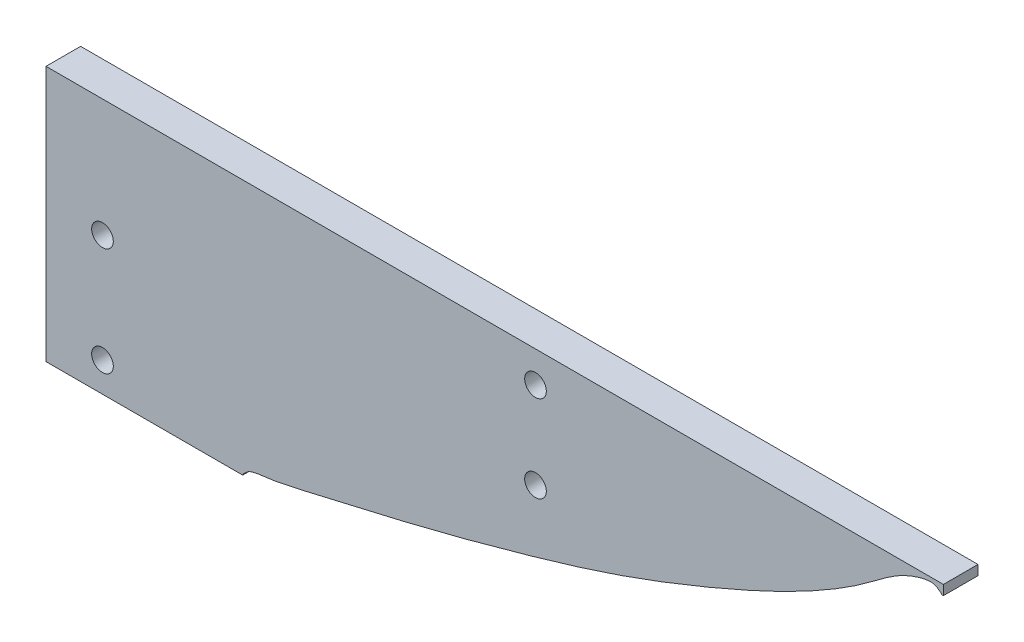
ISO-10303-21;
HEADER;
FILE_DESCRIPTION(('STEP AP214'),'2;1');
FILE_NAME('part.step','',(''),(''),'','','');
FILE_SCHEMA(('AUTOMOTIVE_DESIGN { 1 0 10303 214 1 1 1 1 }'));
ENDSEC;
DATA;
#1=APPLICATION_CONTEXT('core data for automotive mechanical design processes');
#2=APPLICATION_PROTOCOL_DEFINITION('international standard','automotive_design',2000,#1);
#3=PRODUCT_CONTEXT('',#1,'mechanical');
#4=PRODUCT('Part','Part','',(#3));
#5=PRODUCT_RELATED_PRODUCT_CATEGORY('part','',(#4));
#6=PRODUCT_DEFINITION_FORMATION('','',#4);
#7=PRODUCT_DEFINITION_CONTEXT('part definition',#1,'design');
#8=PRODUCT_DEFINITION('design','',#6,#7);
#9=PRODUCT_DEFINITION_SHAPE('','',#8);
#10=(LENGTH_UNIT() NAMED_UNIT(*) SI_UNIT(.MILLI.,.METRE.));
#11=(NAMED_UNIT(*) PLANE_ANGLE_UNIT() SI_UNIT($,.RADIAN.));
#12=(NAMED_UNIT(*) SI_UNIT($,.STERADIAN.) SOLID_ANGLE_UNIT());
#13=UNCERTAINTY_MEASURE_WITH_UNIT(LENGTH_MEASURE(1.E-05),#10,'distance_accuracy_value','');
#14=(GEOMETRIC_REPRESENTATION_CONTEXT(3) GLOBAL_UNCERTAINTY_ASSIGNED_CONTEXT((#13)) GLOBAL_UNIT_ASSIGNED_CONTEXT((#10,
#11,#12)) REPRESENTATION_CONTEXT('',''));
#15=CARTESIAN_POINT('',(0.,0.,0.));
#16=DIRECTION('',(0.,0.,1.));
#17=DIRECTION('',(1.,0.,0.));
#18=AXIS2_PLACEMENT_3D('',#15,#16,#17);
#19=CARTESIAN_POINT('',(16.0234158138627,-34.5026741062025,244.));
#20=DIRECTION('',(0.,0.,-1.));
#21=DIRECTION('',(-1.,0.,0.));
#22=AXIS2_PLACEMENT_3D('',#19,#20,#21);
#23=PLANE('',#22);
#24=CARTESIAN_POINT('',(-100.,-50.,244.));
#25=DIRECTION('',(0.,0.,-1.));
#26=DIRECTION('',(-1.,0.,0.));
#27=AXIS2_PLACEMENT_3D('',#24,#25,#26);
#28=CIRCLE('',#27,2.5);
#29=CARTESIAN_POINT('',(-102.5,-50.,244.));
#30=VERTEX_POINT('',#29);
#31=EDGE_CURVE('E249',#30,#30,#28,.F.);
#32=ORIENTED_EDGE('',*,*,#31,.F.);
#33=EDGE_LOOP('',(#32));
#34=FACE_BOUND('',#33,.T.);
#35=CARTESIAN_POINT('',(0.0705666698621599,-4.96037406111782,244.));
#36=DIRECTION('',(0.,0.,-1.));
#37=DIRECTION('',(-1.,0.,0.));
#38=AXIS2_PLACEMENT_3D('',#35,#36,#37);
#39=CIRCLE('',#38,2.5);
#40=CARTESIAN_POINT('',(-2.42943333013784,-4.96037406111782,244.));
#41=VERTEX_POINT('',#40);
#42=EDGE_CURVE('E159',#41,#41,#39,.F.);
#43=ORIENTED_EDGE('',*,*,#42,.F.);
#44=EDGE_LOOP('',(#43));
#45=FACE_BOUND('',#44,.T.);
#46=DIRECTION('',(0.,1.,0.));
#47=VECTOR('',#46,1.);
#48=CARTESIAN_POINT('',(94.3374906603413,2.25600000000004,244.));
#49=LINE('',#48,#47);
#50=CARTESIAN_POINT('',(94.3374906603413,0.,244.));
#51=VERTEX_POINT('',#50);
#52=CARTESIAN_POINT('',(94.3374906603413,2.25600000000004,244.));
#53=VERTEX_POINT('',#52);
#54=EDGE_CURVE('E211',#51,#53,#49,.T.);
#55=ORIENTED_EDGE('',*,*,#54,.T.);
#56=DIRECTION('',(-1.,0.,0.));
#57=VECTOR('',#56,1.);
#58=CARTESIAN_POINT('',(94.3374906603413,2.25600000000004,244.));
#59=LINE('',#58,#57);
#60=CARTESIAN_POINT('',(-113.053115054968,2.25600000000002,244.));
#61=VERTEX_POINT('',#60);
#62=EDGE_CURVE('E87',#53,#61,#59,.T.);
#63=ORIENTED_EDGE('',*,*,#62,.T.);
#64=DIRECTION('',(0.,-1.,0.));
#65=VECTOR('',#64,1.);
#66=CARTESIAN_POINT('',(-113.053115054968,-56.8547276738667,244.));
#67=LINE('',#66,#65);
#68=CARTESIAN_POINT('',(-113.053115054968,-56.8547276738667,244.));
#69=VERTEX_POINT('',#68);
#70=EDGE_CURVE('E102',#61,#69,#67,.T.);
#71=ORIENTED_EDGE('',*,*,#70,.T.);
#72=CARTESIAN_POINT('',(-67.6058687206929,-56.8418835860353,244.));
#73=CARTESIAN_POINT('',(-82.7549499858999,-56.8485144926589,244.));
#74=CARTESIAN_POINT('',(-97.9040324773684,-56.8526768624681,244.));
#75=CARTESIAN_POINT('',(-113.053115054968,-56.8547276738667,244.));
#76=B_SPLINE_CURVE_WITH_KNOTS('',3,(#72,#73,#74,#75),.UNSPECIFIED.,.F.,.F.,(4,4),(0.,1.),.UNSPECIFIED.);
#77=CARTESIAN_POINT('',(-67.6058687206929,-56.8418835860353,244.));
#78=VERTEX_POINT('',#77);
#79=EDGE_CURVE('E94',#69,#78,#76,.F.);
#80=ORIENTED_EDGE('',*,*,#79,.T.);
#81=CARTESIAN_POINT('',(93.9707930966322,0.,244.));
#82=CARTESIAN_POINT('',(93.9275403182848,0.108219442954762,244.));
#83=CARTESIAN_POINT('',(93.8515123739752,0.197559643684799,244.));
#84=CARTESIAN_POINT('',(93.67922994041,0.351942409052488,244.));
#85=CARTESIAN_POINT('',(93.5863049471862,0.420181322273814,244.));
#86=CARTESIAN_POINT('',(93.3087181605546,0.62646610622649,244.));
#87=CARTESIAN_POINT('',(93.1280757033314,0.770408507314695,244.));
#88=CARTESIAN_POINT('',(92.8363623344284,0.957102782526559,244.));
#89=CARTESIAN_POINT('',(92.7372174680877,1.01507099163973,244.));
#90=CARTESIAN_POINT('',(92.5318138996805,1.11510463160574,244.));
#91=CARTESIAN_POINT('',(92.4251796757464,1.15633059396077,244.));
#92=CARTESIAN_POINT('',(92.2044880205878,1.22218814904138,244.));
#93=CARTESIAN_POINT('',(92.0903333875853,1.24685606961062,244.));
#94=CARTESIAN_POINT('',(91.8632049897598,1.28156541133741,244.));
#95=CARTESIAN_POINT('',(91.7492315764144,1.29196888619851,244.));
#96=CARTESIAN_POINT('',(91.4064338640623,1.30827396637541,244.));
#97=CARTESIAN_POINT('',(91.1759293714281,1.299779944813,244.));
#98=CARTESIAN_POINT('',(90.7175766833427,1.261729398113,244.));
#99=CARTESIAN_POINT('',(90.4907118184743,1.23319773255241,244.));
#100=CARTESIAN_POINT('',(89.8159360684446,1.12367164474916,244.));
#101=CARTESIAN_POINT('',(89.374032052032,1.01797284666055,244.));
#102=CARTESIAN_POINT('',(88.0596026898748,0.654474282836276,244.));
#103=CARTESIAN_POINT('',(87.1942939444121,0.346001243364463,244.));
#104=CARTESIAN_POINT('',(85.5207908631669,-0.358364862036478,244.));
#105=CARTESIAN_POINT('',(84.7112111539212,-0.756873368954198,244.));
#106=CARTESIAN_POINT('',(82.3614627180315,-2.0870706984647,244.));
#107=CARTESIAN_POINT('',(80.8966464527703,-3.14722848406273,244.));
#108=CARTESIAN_POINT('',(78.7184676222512,-4.76993608969079,244.));
#109=CARTESIAN_POINT('',(77.9950027799551,-5.31507038091878,244.));
#110=CARTESIAN_POINT('',(76.5372189539881,-6.38795546293028,244.));
#111=CARTESIAN_POINT('',(75.8041756196282,-6.91778466832084,244.));
#112=CARTESIAN_POINT('',(73.5820071703193,-8.4705713661439,244.));
#113=CARTESIAN_POINT('',(72.0687676522482,-9.45511390944258,244.));
#114=CARTESIAN_POINT('',(68.999021363187,-11.3552729972661,244.));
#115=CARTESIAN_POINT('',(67.4429916362822,-12.2716494869643,244.));
#116=CARTESIAN_POINT('',(64.2992114706245,-14.0538704450642,244.));
#117=CARTESIAN_POINT('',(62.7111094292256,-14.9191824328191,244.));
#118=CARTESIAN_POINT('',(59.5025622507668,-16.5981721855823,244.));
#119=CARTESIAN_POINT('',(57.8852599548048,-17.4109944878017,244.));
#120=CARTESIAN_POINT('',(54.6299645111503,-18.9942804538438,244.));
#121=CARTESIAN_POINT('',(52.9920024867879,-19.7649381513053,244.));
#122=CARTESIAN_POINT('',(49.7020068935009,-21.2769109339562,244.));
#123=CARTESIAN_POINT('',(48.0505965279488,-22.0177488041862,244.));
#124=CARTESIAN_POINT('',(43.0792383362596,-24.1998027856536,244.));
#125=CARTESIAN_POINT('',(39.7428210008403,-25.602112693722,244.));
#126=CARTESIAN_POINT('',(33.0338549618342,-28.3213787615113,244.));
#127=CARTESIAN_POINT('',(29.660726288783,-29.6383328992337,244.));
#128=CARTESIAN_POINT('',(22.8742607575603,-32.1610889929733,244.));
#129=CARTESIAN_POINT('',(19.4582616287561,-33.3629495630936,244.));
#130=CARTESIAN_POINT('',(12.5885699989693,-35.6423986493115,244.));
#131=CARTESIAN_POINT('',(9.13439519223916,-36.7214663933854,244.));
#132=CARTESIAN_POINT('',(2.20083527520231,-38.8004887891085,244.));
#133=CARTESIAN_POINT('',(-1.27752092467049,-39.8040045908362,244.));
#134=CARTESIAN_POINT('',(-8.24529714298655,-41.7673553220059,244.));
#135=CARTESIAN_POINT('',(-11.7355628978581,-42.7258900143628,244.));
#136=CARTESIAN_POINT('',(-18.7316863652625,-44.5863854823952,244.));
#137=CARTESIAN_POINT('',(-22.237775764295,-45.4876819452554,244.));
#138=CARTESIAN_POINT('',(-29.2636636323704,-47.2337799191878,244.));
#139=CARTESIAN_POINT('',(-32.7836131588108,-48.0789347968884,244.));
#140=CARTESIAN_POINT('',(-39.8300278640101,-49.7409646669693,244.));
#141=CARTESIAN_POINT('',(-43.3563547751734,-50.558718901895,244.));
#142=CARTESIAN_POINT('',(-48.6467948336615,-51.7811456585302,244.));
#143=CARTESIAN_POINT('',(-50.4106152657908,-52.1871708019159,244.));
#144=CARTESIAN_POINT('',(-53.0579396863378,-52.7891825790351,244.));
#145=CARTESIAN_POINT('',(-53.9406500835586,-52.9886663444595,244.));
#146=CARTESIAN_POINT('',(-55.7065733356938,-53.3854164049983,244.));
#147=CARTESIAN_POINT('',(-56.5893083246826,-53.585137271377,244.));
#148=CARTESIAN_POINT('',(-58.3580405043806,-53.9675043255969,244.));
#149=CARTESIAN_POINT('',(-59.244603599218,-54.1472728377844,244.));
#150=CARTESIAN_POINT('',(-60.5823987338824,-54.3756171020032,244.));
#151=CARTESIAN_POINT('',(-61.029600199552,-54.4451345744217,244.));
#152=CARTESIAN_POINT('',(-61.9267430162625,-54.5699338518092,244.));
#153=CARTESIAN_POINT('',(-62.3771743694561,-54.6226697445405,244.));
#154=CARTESIAN_POINT('',(-63.2789656383133,-54.7233169827186,244.));
#155=CARTESIAN_POINT('',(-63.7296802314879,-54.7745812408264,244.));
#156=CARTESIAN_POINT('',(-64.6233397254468,-54.9174788754777,244.));
#157=CARTESIAN_POINT('',(-65.0671747111058,-55.0044876234114,244.));
#158=CARTESIAN_POINT('',(-65.7167553540409,-55.2190250170581,244.));
#159=CARTESIAN_POINT('',(-65.9327296769614,-55.3064650102381,244.));
#160=CARTESIAN_POINT('',(-66.3446965323808,-55.5260279098127,244.));
#161=CARTESIAN_POINT('',(-66.5334026612515,-55.6577750476709,244.));
#162=CARTESIAN_POINT('',(-66.8877333850458,-55.9506142910006,244.));
#163=CARTESIAN_POINT('',(-67.0521612729492,-56.1132278433931,244.));
#164=CARTESIAN_POINT('',(-67.2957794548117,-56.3609923233848,244.));
#165=CARTESIAN_POINT('',(-67.3758082959976,-56.444932838751,244.));
#166=CARTESIAN_POINT('',(-67.5186403225355,-56.6274554545185,244.));
#167=CARTESIAN_POINT('',(-67.5797396857252,-56.729557594596,244.));
#168=CARTESIAN_POINT('',(-67.6058687206929,-56.8418835860353,244.));
#169=B_SPLINE_CURVE_WITH_KNOTS('',3,(#81,#82,#83,#84,#85,#86,#87,#88,#89,#90,#91,#92,#93,#94,
#95,#96,#97,#98,#99,#100,#101,#102,#103,#104,#105,#106,#107,#108,#109,#110,#111,#112,#113,#114,
#115,#116,#117,#118,#119,#120,#121,#122,#123,#124,#125,#126,#127,#128,#129,#130,#131,#132,#133,
#134,#135,#136,#137,#138,#139,#140,#141,#142,#143,#144,#145,#146,#147,#148,#149,#150,#151,#152,
#153,#154,#155,#156,#157,#158,#159,#160,#161,#162,#163,#164,#165,#166,#167,#168),.UNSPECIFIED.,
.F.,.F.,(4,2,2,2,2,2,2,2,2,2,2,2,2,2,2,2,2,2,2,2,2,2,2,2,2,2,2,2,2,2,2,2,2,2,2,2,2,2,2,2,2,2,2,
4),(0.,0.001953125,0.00390625,0.00781249999999978,0.00976562499999978,0.0117187499999998,
0.0136718749999998,0.0156249999999998,0.0195312499999998,0.0234374999999998,0.0312499999999998,
0.0468749999999998,0.0624999999999998,0.0937499999999996,0.109374999999999,0.124999999999999,
0.156249999999999,0.187499999999999,0.218749999999999,0.249999999999999,0.281249999999999,
0.312499999999999,0.374999999999999,0.4375,0.5,0.5625,0.625,0.6875,0.75,0.8125,0.875,0.90625,
0.921875,0.9375,0.953125,0.9609375,0.96875,0.9765625,0.984375,0.98828125,0.9921875,0.99609375,
0.998046875,1.),.UNSPECIFIED.);
#170=CARTESIAN_POINT('',(93.9707930966322,0.,244.));
#171=VERTEX_POINT('',#170);
#172=EDGE_CURVE('E99',#78,#171,#169,.F.);
#173=ORIENTED_EDGE('',*,*,#172,.T.);
#174=DIRECTION('',(1.,0.,0.));
#175=VECTOR('',#174,1.);
#176=CARTESIAN_POINT('',(93.9707930966346,0.,244.));
#177=LINE('',#176,#175);
#178=EDGE_CURVE('E49',#171,#51,#177,.T.);
#179=ORIENTED_EDGE('',*,*,#178,.T.);
#180=EDGE_LOOP('',(#55,#63,#71,#80,#173,#179));
#181=FACE_BOUND('',#180,.T.);
#182=CARTESIAN_POINT('',(0.0705666698621599,-25.,244.));
#183=DIRECTION('',(0.,0.,-1.));
#184=DIRECTION('',(-1.,0.,0.));
#185=AXIS2_PLACEMENT_3D('',#182,#183,#184);
#186=CIRCLE('',#185,2.5);
#187=CARTESIAN_POINT('',(-2.42943333013784,-25.,244.));
#188=VERTEX_POINT('',#187);
#189=EDGE_CURVE('E256',#188,#188,#186,.F.);
#190=ORIENTED_EDGE('',*,*,#189,.F.);
#191=EDGE_LOOP('',(#190));
#192=FACE_BOUND('',#191,.T.);
#193=CARTESIAN_POINT('',(-100.,-25.,244.));
#194=DIRECTION('',(0.,0.,-1.));
#195=DIRECTION('',(-1.,0.,0.));
#196=AXIS2_PLACEMENT_3D('',#193,#194,#195);
#197=CIRCLE('',#196,2.5);
#198=CARTESIAN_POINT('',(-102.5,-25.,244.));
#199=VERTEX_POINT('',#198);
#200=EDGE_CURVE('E279',#199,#199,#197,.F.);
#201=ORIENTED_EDGE('',*,*,#200,.F.);
#202=EDGE_LOOP('',(#201));
#203=FACE_BOUND('',#202,.T.);
#204=ADVANCED_FACE('F30',(#34,#45,#181,#192,#203),#23,.F.);
#205=CARTESIAN_POINT('',(16.0234158138627,-34.5026741062025,236.));
#206=DIRECTION('',(0.,0.,-1.));
#207=DIRECTION('',(-1.,0.,0.));
#208=AXIS2_PLACEMENT_3D('',#205,#206,#207);
#209=PLANE('',#208);
#210=CARTESIAN_POINT('',(-100.,-50.,236.));
#211=DIRECTION('',(0.,0.,-1.));
#212=DIRECTION('',(-1.,0.,0.));
#213=AXIS2_PLACEMENT_3D('',#210,#211,#212);
#214=CIRCLE('',#213,2.5);
#215=CARTESIAN_POINT('',(-102.5,-50.,236.));
#216=VERTEX_POINT('',#215);
#217=EDGE_CURVE('E278',#216,#216,#214,.F.);
#218=ORIENTED_EDGE('',*,*,#217,.T.);
#219=EDGE_LOOP('',(#218));
#220=FACE_BOUND('',#219,.T.);
#221=CARTESIAN_POINT('',(0.0705666698621599,-4.96037406111782,236.));
#222=DIRECTION('',(0.,0.,-1.));
#223=DIRECTION('',(-1.,0.,0.));
#224=AXIS2_PLACEMENT_3D('',#221,#222,#223);
#225=CIRCLE('',#224,2.5);
#226=CARTESIAN_POINT('',(-2.42943333013784,-4.96037406111782,236.));
#227=VERTEX_POINT('',#226);
#228=EDGE_CURVE('E253',#227,#227,#225,.F.);
#229=ORIENTED_EDGE('',*,*,#228,.T.);
#230=EDGE_LOOP('',(#229));
#231=FACE_BOUND('',#230,.T.);
#232=DIRECTION('',(0.,1.,0.));
#233=VECTOR('',#232,1.);
#234=CARTESIAN_POINT('',(94.3374906603413,2.25600000000004,236.));
#235=LINE('',#234,#233);
#236=CARTESIAN_POINT('',(94.3374906603413,0.,236.));
#237=VERTEX_POINT('',#236);
#238=CARTESIAN_POINT('',(94.3374906603413,2.25600000000004,236.));
#239=VERTEX_POINT('',#238);
#240=EDGE_CURVE('E152',#237,#239,#235,.T.);
#241=ORIENTED_EDGE('',*,*,#240,.F.);
#242=DIRECTION('',(1.,0.,0.));
#243=VECTOR('',#242,1.);
#244=CARTESIAN_POINT('',(93.9707930966346,0.,236.));
#245=LINE('',#244,#243);
#246=CARTESIAN_POINT('',(93.9707930966322,0.,236.));
#247=VERTEX_POINT('',#246);
#248=EDGE_CURVE('E79',#247,#237,#245,.T.);
#249=ORIENTED_EDGE('',*,*,#248,.F.);
#250=CARTESIAN_POINT('',(-67.6058687206929,-56.8418835860353,236.));
#251=CARTESIAN_POINT('',(-67.5797396857252,-56.729557594596,236.));
#252=CARTESIAN_POINT('',(-67.5186403225355,-56.6274554545185,236.));
#253=CARTESIAN_POINT('',(-67.3758082959976,-56.444932838751,236.));
#254=CARTESIAN_POINT('',(-67.2957794548117,-56.3609923233848,236.));
#255=CARTESIAN_POINT('',(-67.0521612729492,-56.1132278433931,236.));
#256=CARTESIAN_POINT('',(-66.8877333850458,-55.9506142910006,236.));
#257=CARTESIAN_POINT('',(-66.5334026612515,-55.6577750476709,236.));
#258=CARTESIAN_POINT('',(-66.3446965323808,-55.5260279098127,236.));
#259=CARTESIAN_POINT('',(-65.9327296769614,-55.3064650102381,236.));
#260=CARTESIAN_POINT('',(-65.7167553540409,-55.2190250170581,236.));
#261=CARTESIAN_POINT('',(-65.0671747111058,-55.0044876234114,236.));
#262=CARTESIAN_POINT('',(-64.6233397254468,-54.9174788754777,236.));
#263=CARTESIAN_POINT('',(-63.7296802314879,-54.7745812408264,236.));
#264=CARTESIAN_POINT('',(-63.2789656383133,-54.7233169827186,236.));
#265=CARTESIAN_POINT('',(-62.3771743694561,-54.6226697445405,236.));
#266=CARTESIAN_POINT('',(-61.9267430162625,-54.5699338518092,236.));
#267=CARTESIAN_POINT('',(-61.029600199552,-54.4451345744217,236.));
#268=CARTESIAN_POINT('',(-60.5823987338824,-54.3756171020032,236.));
#269=CARTESIAN_POINT('',(-59.244603599218,-54.1472728377844,236.));
#270=CARTESIAN_POINT('',(-58.3580405043806,-53.9675043255969,236.));
#271=CARTESIAN_POINT('',(-56.5893083246826,-53.585137271377,236.));
#272=CARTESIAN_POINT('',(-55.7065733356938,-53.3854164049983,236.));
#273=CARTESIAN_POINT('',(-53.9406500835586,-52.9886663444595,236.));
#274=CARTESIAN_POINT('',(-53.0579396863378,-52.7891825790351,236.));
#275=CARTESIAN_POINT('',(-50.4106152657908,-52.1871708019159,236.));
#276=CARTESIAN_POINT('',(-48.6467948336615,-51.7811456585302,236.));
#277=CARTESIAN_POINT('',(-43.3563547751734,-50.558718901895,236.));
#278=CARTESIAN_POINT('',(-39.8300278640101,-49.7409646669693,236.));
#279=CARTESIAN_POINT('',(-32.7836131588108,-48.0789347968884,236.));
#280=CARTESIAN_POINT('',(-29.2636636323704,-47.2337799191878,236.));
#281=CARTESIAN_POINT('',(-22.237775764295,-45.4876819452554,236.));
#282=CARTESIAN_POINT('',(-18.7316863652625,-44.5863854823952,236.));
#283=CARTESIAN_POINT('',(-11.7355628978581,-42.7258900143628,236.));
#284=CARTESIAN_POINT('',(-8.24529714298655,-41.7673553220059,236.));
#285=CARTESIAN_POINT('',(-1.27752092467049,-39.8040045908362,236.));
#286=CARTESIAN_POINT('',(2.20083527520231,-38.8004887891085,236.));
#287=CARTESIAN_POINT('',(9.13439519223916,-36.7214663933854,236.));
#288=CARTESIAN_POINT('',(12.5885699989693,-35.6423986493115,236.));
#289=CARTESIAN_POINT('',(19.4582616287561,-33.3629495630936,236.));
#290=CARTESIAN_POINT('',(22.8742607575603,-32.1610889929733,236.));
#291=CARTESIAN_POINT('',(29.660726288783,-29.6383328992337,236.));
#292=CARTESIAN_POINT('',(33.0338549618342,-28.3213787615113,236.));
#293=CARTESIAN_POINT('',(39.7428210008403,-25.602112693722,236.));
#294=CARTESIAN_POINT('',(43.0792383362596,-24.1998027856536,236.));
#295=CARTESIAN_POINT('',(48.0505965279488,-22.0177488041862,236.));
#296=CARTESIAN_POINT('',(49.7020068935009,-21.2769109339562,236.));
#297=CARTESIAN_POINT('',(52.9920024867879,-19.7649381513053,236.));
#298=CARTESIAN_POINT('',(54.6299645111503,-18.9942804538438,236.));
#299=CARTESIAN_POINT('',(57.8852599548048,-17.4109944878017,236.));
#300=CARTESIAN_POINT('',(59.5025622507668,-16.5981721855823,236.));
#301=CARTESIAN_POINT('',(62.7111094292256,-14.9191824328191,236.));
#302=CARTESIAN_POINT('',(64.2992114706245,-14.0538704450642,236.));
#303=CARTESIAN_POINT('',(67.4429916362822,-12.2716494869643,236.));
#304=CARTESIAN_POINT('',(68.999021363187,-11.3552729972661,236.));
#305=CARTESIAN_POINT('',(72.0687676522482,-9.45511390944258,236.));
#306=CARTESIAN_POINT('',(73.5820071703193,-8.4705713661439,236.));
#307=CARTESIAN_POINT('',(75.8041756196282,-6.91778466832084,236.));
#308=CARTESIAN_POINT('',(76.5372189539881,-6.38795546293028,236.));
#309=CARTESIAN_POINT('',(77.9950027799551,-5.31507038091878,236.));
#310=CARTESIAN_POINT('',(78.7184676222512,-4.76993608969079,236.));
#311=CARTESIAN_POINT('',(80.8966464527703,-3.14722848406273,236.));
#312=CARTESIAN_POINT('',(82.3614627180315,-2.0870706984647,236.));
#313=CARTESIAN_POINT('',(84.7112111539212,-0.756873368954198,236.));
#314=CARTESIAN_POINT('',(85.5207908631669,-0.358364862036478,236.));
#315=CARTESIAN_POINT('',(87.1942939444121,0.346001243364463,236.));
#316=CARTESIAN_POINT('',(88.0596026898748,0.654474282836276,236.));
#317=CARTESIAN_POINT('',(89.374032052032,1.01797284666055,236.));
#318=CARTESIAN_POINT('',(89.8159360684446,1.12367164474916,236.));
#319=CARTESIAN_POINT('',(90.4907118184743,1.23319773255241,236.));
#320=CARTESIAN_POINT('',(90.7175766833427,1.261729398113,236.));
#321=CARTESIAN_POINT('',(91.1759293714281,1.299779944813,236.));
#322=CARTESIAN_POINT('',(91.4064338640623,1.30827396637541,236.));
#323=CARTESIAN_POINT('',(91.7492315764144,1.29196888619851,236.));
#324=CARTESIAN_POINT('',(91.8632049897598,1.28156541133741,236.));
#325=CARTESIAN_POINT('',(92.0903333875853,1.24685606961062,236.));
#326=CARTESIAN_POINT('',(92.2044880205878,1.22218814904138,236.));
#327=CARTESIAN_POINT('',(92.4251796757464,1.15633059396077,236.));
#328=CARTESIAN_POINT('',(92.5318138996805,1.11510463160574,236.));
#329=CARTESIAN_POINT('',(92.7372174680877,1.01507099163973,236.));
#330=CARTESIAN_POINT('',(92.8363623344284,0.957102782526559,236.));
#331=CARTESIAN_POINT('',(93.1280757033314,0.770408507314695,236.));
#332=CARTESIAN_POINT('',(93.3087181605546,0.62646610622649,236.));
#333=CARTESIAN_POINT('',(93.5863049471862,0.420181322273814,236.));
#334=CARTESIAN_POINT('',(93.67922994041,0.351942409052488,236.));
#335=CARTESIAN_POINT('',(93.8515123739752,0.197559643684799,236.));
#336=CARTESIAN_POINT('',(93.9275403182848,0.108219442954762,236.));
#337=CARTESIAN_POINT('',(93.9707930966322,0.,236.));
#338=B_SPLINE_CURVE_WITH_KNOTS('',3,(#250,#251,#252,#253,#254,#255,#256,#257,#258,#259,#260,
#261,#262,#263,#264,#265,#266,#267,#268,#269,#270,#271,#272,#273,#274,#275,#276,#277,#278,#279,
#280,#281,#282,#283,#284,#285,#286,#287,#288,#289,#290,#291,#292,#293,#294,#295,#296,#297,#298,
#299,#300,#301,#302,#303,#304,#305,#306,#307,#308,#309,#310,#311,#312,#313,#314,#315,#316,#317,
#318,#319,#320,#321,#322,#323,#324,#325,#326,#327,#328,#329,#330,#331,#332,#333,#334,#335,#336,
#337),.UNSPECIFIED.,.F.,.F.,(4,2,2,2,2,2,2,2,2,2,2,2,2,2,2,2,2,2,2,2,2,2,2,2,2,2,2,2,2,2,2,2,2,
2,2,2,2,2,2,2,2,2,2,4),(0.,0.001953125,0.00390624999999989,0.00781249999999989,
0.0117187499999999,0.0156249999999999,0.0234374999999998,0.0312499999999998,0.0390624999999998,
0.0468749999999998,0.0624999999999997,0.0781249999999997,0.0937499999999996,0.125,0.1875,0.25,
0.3125,0.375,0.4375,0.5,0.5625,0.625000000000001,0.687500000000001,0.718750000000001,
0.750000000000001,0.781250000000001,0.812500000000001,0.843750000000001,0.875000000000001,
0.890625000000001,0.90625,0.9375,0.953125,0.96875,0.9765625,0.98046875,0.984375,0.986328125,
0.98828125,0.990234375,0.9921875,0.99609375,0.998046875,1.),.UNSPECIFIED.);
#339=CARTESIAN_POINT('',(-67.6058687206929,-56.8418835860353,236.));
#340=VERTEX_POINT('',#339);
#341=EDGE_CURVE('E72',#340,#247,#338,.T.);
#342=ORIENTED_EDGE('',*,*,#341,.F.);
#343=CARTESIAN_POINT('',(-113.053115054968,-56.8547276738667,236.));
#344=CARTESIAN_POINT('',(-97.9040324773684,-56.8526768624681,236.));
#345=CARTESIAN_POINT('',(-82.7549499858999,-56.8485144926589,236.));
#346=CARTESIAN_POINT('',(-67.6058687206929,-56.8418835860353,236.));
#347=B_SPLINE_CURVE_WITH_KNOTS('',3,(#343,#344,#345,#346),.UNSPECIFIED.,.F.,.F.,(4,4),(0.,1.),.UNSPECIFIED.);
#348=CARTESIAN_POINT('',(-113.053115054968,-56.8547276738667,236.));
#349=VERTEX_POINT('',#348);
#350=EDGE_CURVE('E112',#349,#340,#347,.T.);
#351=ORIENTED_EDGE('',*,*,#350,.F.);
#352=DIRECTION('',(0.,-1.,0.));
#353=VECTOR('',#352,1.);
#354=CARTESIAN_POINT('',(-113.053115054968,-56.8547276738667,236.));
#355=LINE('',#354,#353);
#356=CARTESIAN_POINT('',(-113.053115054968,2.25600000000002,236.));
#357=VERTEX_POINT('',#356);
#358=EDGE_CURVE('E161',#357,#349,#355,.T.);
#359=ORIENTED_EDGE('',*,*,#358,.F.);
#360=DIRECTION('',(-1.,0.,0.));
#361=VECTOR('',#360,1.);
#362=CARTESIAN_POINT('',(94.3374906603413,2.25600000000004,236.));
#363=LINE('',#362,#361);
#364=EDGE_CURVE('E158',#239,#357,#363,.T.);
#365=ORIENTED_EDGE('',*,*,#364,.F.);
#366=EDGE_LOOP('',(#241,#249,#342,#351,#359,#365));
#367=FACE_BOUND('',#366,.T.);
#368=CARTESIAN_POINT('',(0.0705666698621599,-25.,236.));
#369=DIRECTION('',(0.,0.,-1.));
#370=DIRECTION('',(-1.,0.,0.));
#371=AXIS2_PLACEMENT_3D('',#368,#369,#370);
#372=CIRCLE('',#371,2.5);
#373=CARTESIAN_POINT('',(-2.42943333013784,-25.,236.));
#374=VERTEX_POINT('',#373);
#375=EDGE_CURVE('E276',#374,#374,#372,.F.);
#376=ORIENTED_EDGE('',*,*,#375,.T.);
#377=EDGE_LOOP('',(#376));
#378=FACE_BOUND('',#377,.T.);
#379=CARTESIAN_POINT('',(-100.,-25.,236.));
#380=DIRECTION('',(0.,0.,-1.));
#381=DIRECTION('',(-1.,0.,0.));
#382=AXIS2_PLACEMENT_3D('',#379,#380,#381);
#383=CIRCLE('',#382,2.5);
#384=CARTESIAN_POINT('',(-102.5,-25.,236.));
#385=VERTEX_POINT('',#384);
#386=EDGE_CURVE('E34',#385,#385,#383,.F.);
#387=ORIENTED_EDGE('',*,*,#386,.T.);
#388=EDGE_LOOP('',(#387));
#389=FACE_BOUND('',#388,.T.);
#390=ADVANCED_FACE('F188',(#220,#231,#367,#378,#389),#209,.T.);
#391=CARTESIAN_POINT('',(94.3374906603413,2.25600000000004,244.));
#392=DIRECTION('',(-1.,0.,0.));
#393=DIRECTION('',(0.,0.,1.));
#394=AXIS2_PLACEMENT_3D('',#391,#392,#393);
#395=PLANE('',#394);
#396=ORIENTED_EDGE('',*,*,#240,.T.);
#397=DIRECTION('',(0.,0.,-1.));
#398=VECTOR('',#397,1.);
#399=CARTESIAN_POINT('',(94.3374906603413,2.25600000000004,244.));
#400=LINE('',#399,#398);
#401=EDGE_CURVE('E11',#53,#239,#400,.T.);
#402=ORIENTED_EDGE('',*,*,#401,.F.);
#403=ORIENTED_EDGE('',*,*,#54,.F.);
#404=DIRECTION('',(0.,0.,-1.));
#405=VECTOR('',#404,1.);
#406=CARTESIAN_POINT('',(94.3374906603413,0.,244.));
#407=LINE('',#406,#405);
#408=EDGE_CURVE('E162',#51,#237,#407,.T.);
#409=ORIENTED_EDGE('',*,*,#408,.T.);
#410=EDGE_LOOP('',(#396,#402,#403,#409));
#411=FACE_BOUND('',#410,.T.);
#412=ADVANCED_FACE('F32',(#411),#395,.F.);
#413=CARTESIAN_POINT('',(94.3374906603413,2.25600000000004,244.));
#414=DIRECTION('',(0.,-1.,0.));
#415=DIRECTION('',(1.,0.,0.));
#416=AXIS2_PLACEMENT_3D('',#413,#414,#415);
#417=PLANE('',#416);
#418=ORIENTED_EDGE('',*,*,#364,.T.);
#419=DIRECTION('',(0.,0.,-1.));
#420=VECTOR('',#419,1.);
#421=CARTESIAN_POINT('',(-113.053115054968,2.25600000000002,244.));
#422=LINE('',#421,#420);
#423=EDGE_CURVE('E40',#61,#357,#422,.T.);
#424=ORIENTED_EDGE('',*,*,#423,.F.);
#425=ORIENTED_EDGE('',*,*,#62,.F.);
#426=ORIENTED_EDGE('',*,*,#401,.T.);
#427=EDGE_LOOP('',(#418,#424,#425,#426));
#428=FACE_BOUND('',#427,.T.);
#429=ADVANCED_FACE('F218',(#428),#417,.F.);
#430=CARTESIAN_POINT('',(-113.053115054968,-56.8547276738667,244.));
#431=DIRECTION('',(1.,0.,0.));
#432=DIRECTION('',(0.,1.,0.));
#433=AXIS2_PLACEMENT_3D('',#430,#431,#432);
#434=PLANE('',#433);
#435=ORIENTED_EDGE('',*,*,#358,.T.);
#436=DIRECTION('',(0.,0.,-1.));
#437=VECTOR('',#436,1.);
#438=CARTESIAN_POINT('',(-113.053115054968,-56.8547276738667,244.));
#439=LINE('',#438,#437);
#440=EDGE_CURVE('E114',#69,#349,#439,.T.);
#441=ORIENTED_EDGE('',*,*,#440,.F.);
#442=ORIENTED_EDGE('',*,*,#70,.F.);
#443=ORIENTED_EDGE('',*,*,#423,.T.);
#444=EDGE_LOOP('',(#435,#441,#442,#443));
#445=FACE_BOUND('',#444,.T.);
#446=ADVANCED_FACE('F214',(#445),#434,.F.);
#447=CARTESIAN_POINT('',(-113.053115054968,-56.8547276738667,244.));
#448=CARTESIAN_POINT('',(-97.9040324773684,-56.8526768624681,244.));
#449=CARTESIAN_POINT('',(-82.7549499858999,-56.8485144926589,244.));
#450=CARTESIAN_POINT('',(-67.6058687206929,-56.8418835860353,244.));
#451=B_SPLINE_CURVE_WITH_KNOTS('',3,(#447,#448,#449,#450),.UNSPECIFIED.,.F.,.F.,(4,4),(0.,1.),.UNSPECIFIED.);
#452=DIRECTION('',(0.,0.,-1.));
#453=VECTOR('',#452,1.);
#454=SURFACE_OF_LINEAR_EXTRUSION('',#451,#453);
#455=ORIENTED_EDGE('',*,*,#350,.T.);
#456=DIRECTION('',(0.,0.,-1.));
#457=VECTOR('',#456,1.);
#458=CARTESIAN_POINT('',(-67.6058687206929,-56.8418835860353,244.));
#459=LINE('',#458,#457);
#460=EDGE_CURVE('E109',#78,#340,#459,.T.);
#461=ORIENTED_EDGE('',*,*,#460,.F.);
#462=ORIENTED_EDGE('',*,*,#79,.F.);
#463=ORIENTED_EDGE('',*,*,#440,.T.);
#464=EDGE_LOOP('',(#455,#461,#462,#463));
#465=FACE_BOUND('',#464,.T.);
#466=ADVANCED_FACE('F110',(#465),#454,.F.);
#467=CARTESIAN_POINT('',(-67.6058687206929,-56.8418835860353,244.));
#468=CARTESIAN_POINT('',(-67.5797396857252,-56.729557594596,244.));
#469=CARTESIAN_POINT('',(-67.5186403225355,-56.6274554545185,244.));
#470=CARTESIAN_POINT('',(-67.3758082959976,-56.444932838751,244.));
#471=CARTESIAN_POINT('',(-67.2957794548117,-56.3609923233848,244.));
#472=CARTESIAN_POINT('',(-67.0521612729492,-56.1132278433931,244.));
#473=CARTESIAN_POINT('',(-66.8877333850458,-55.9506142910006,244.));
#474=CARTESIAN_POINT('',(-66.5334026612515,-55.6577750476709,244.));
#475=CARTESIAN_POINT('',(-66.3446965323808,-55.5260279098127,244.));
#476=CARTESIAN_POINT('',(-65.9327296769614,-55.3064650102381,244.));
#477=CARTESIAN_POINT('',(-65.7167553540409,-55.2190250170581,244.));
#478=CARTESIAN_POINT('',(-65.0671747111058,-55.0044876234114,244.));
#479=CARTESIAN_POINT('',(-64.6233397254468,-54.9174788754777,244.));
#480=CARTESIAN_POINT('',(-63.7296802314879,-54.7745812408264,244.));
#481=CARTESIAN_POINT('',(-63.2789656383133,-54.7233169827186,244.));
#482=CARTESIAN_POINT('',(-62.3771743694561,-54.6226697445405,244.));
#483=CARTESIAN_POINT('',(-61.9267430162625,-54.5699338518092,244.));
#484=CARTESIAN_POINT('',(-61.029600199552,-54.4451345744217,244.));
#485=CARTESIAN_POINT('',(-60.5823987338824,-54.3756171020032,244.));
#486=CARTESIAN_POINT('',(-59.244603599218,-54.1472728377844,244.));
#487=CARTESIAN_POINT('',(-58.3580405043806,-53.9675043255969,244.));
#488=CARTESIAN_POINT('',(-56.5893083246826,-53.585137271377,244.));
#489=CARTESIAN_POINT('',(-55.7065733356938,-53.3854164049983,244.));
#490=CARTESIAN_POINT('',(-53.9406500835586,-52.9886663444595,244.));
#491=CARTESIAN_POINT('',(-53.0579396863378,-52.7891825790351,244.));
#492=CARTESIAN_POINT('',(-50.4106152657908,-52.1871708019159,244.));
#493=CARTESIAN_POINT('',(-48.6467948336615,-51.7811456585302,244.));
#494=CARTESIAN_POINT('',(-43.3563547751734,-50.558718901895,244.));
#495=CARTESIAN_POINT('',(-39.8300278640101,-49.7409646669693,244.));
#496=CARTESIAN_POINT('',(-32.7836131588108,-48.0789347968884,244.));
#497=CARTESIAN_POINT('',(-29.2636636323704,-47.2337799191878,244.));
#498=CARTESIAN_POINT('',(-22.237775764295,-45.4876819452554,244.));
#499=CARTESIAN_POINT('',(-18.7316863652625,-44.5863854823952,244.));
#500=CARTESIAN_POINT('',(-11.7355628978581,-42.7258900143628,244.));
#501=CARTESIAN_POINT('',(-8.24529714298655,-41.7673553220059,244.));
#502=CARTESIAN_POINT('',(-1.27752092467049,-39.8040045908362,244.));
#503=CARTESIAN_POINT('',(2.20083527520231,-38.8004887891085,244.));
#504=CARTESIAN_POINT('',(9.13439519223916,-36.7214663933854,244.));
#505=CARTESIAN_POINT('',(12.5885699989693,-35.6423986493115,244.));
#506=CARTESIAN_POINT('',(19.4582616287561,-33.3629495630936,244.));
#507=CARTESIAN_POINT('',(22.8742607575603,-32.1610889929733,244.));
#508=CARTESIAN_POINT('',(29.660726288783,-29.6383328992337,244.));
#509=CARTESIAN_POINT('',(33.0338549618342,-28.3213787615113,244.));
#510=CARTESIAN_POINT('',(39.7428210008403,-25.602112693722,244.));
#511=CARTESIAN_POINT('',(43.0792383362596,-24.1998027856536,244.));
#512=CARTESIAN_POINT('',(48.0505965279488,-22.0177488041862,244.));
#513=CARTESIAN_POINT('',(49.7020068935009,-21.2769109339562,244.));
#514=CARTESIAN_POINT('',(52.9920024867879,-19.7649381513053,244.));
#515=CARTESIAN_POINT('',(54.6299645111503,-18.9942804538438,244.));
#516=CARTESIAN_POINT('',(57.8852599548048,-17.4109944878017,244.));
#517=CARTESIAN_POINT('',(59.5025622507668,-16.5981721855823,244.));
#518=CARTESIAN_POINT('',(62.7111094292256,-14.9191824328191,244.));
#519=CARTESIAN_POINT('',(64.2992114706245,-14.0538704450642,244.));
#520=CARTESIAN_POINT('',(67.4429916362822,-12.2716494869643,244.));
#521=CARTESIAN_POINT('',(68.999021363187,-11.3552729972661,244.));
#522=CARTESIAN_POINT('',(72.0687676522482,-9.45511390944258,244.));
#523=CARTESIAN_POINT('',(73.5820071703193,-8.4705713661439,244.));
#524=CARTESIAN_POINT('',(75.8041756196282,-6.91778466832084,244.));
#525=CARTESIAN_POINT('',(76.5372189539881,-6.38795546293028,244.));
#526=CARTESIAN_POINT('',(77.9950027799551,-5.31507038091878,244.));
#527=CARTESIAN_POINT('',(78.7184676222512,-4.76993608969079,244.));
#528=CARTESIAN_POINT('',(80.8966464527703,-3.14722848406273,244.));
#529=CARTESIAN_POINT('',(82.3614627180315,-2.0870706984647,244.));
#530=CARTESIAN_POINT('',(84.7112111539212,-0.756873368954198,244.));
#531=CARTESIAN_POINT('',(85.5207908631669,-0.358364862036478,244.));
#532=CARTESIAN_POINT('',(87.1942939444121,0.346001243364463,244.));
#533=CARTESIAN_POINT('',(88.0596026898748,0.654474282836276,244.));
#534=CARTESIAN_POINT('',(89.374032052032,1.01797284666055,244.));
#535=CARTESIAN_POINT('',(89.8159360684446,1.12367164474916,244.));
#536=CARTESIAN_POINT('',(90.4907118184743,1.23319773255241,244.));
#537=CARTESIAN_POINT('',(90.7175766833427,1.261729398113,244.));
#538=CARTESIAN_POINT('',(91.1759293714281,1.299779944813,244.));
#539=CARTESIAN_POINT('',(91.4064338640623,1.30827396637541,244.));
#540=CARTESIAN_POINT('',(91.7492315764144,1.29196888619851,244.));
#541=CARTESIAN_POINT('',(91.8632049897598,1.28156541133741,244.));
#542=CARTESIAN_POINT('',(92.0903333875853,1.24685606961062,244.));
#543=CARTESIAN_POINT('',(92.2044880205878,1.22218814904138,244.));
#544=CARTESIAN_POINT('',(92.4251796757464,1.15633059396077,244.));
#545=CARTESIAN_POINT('',(92.5318138996805,1.11510463160574,244.));
#546=CARTESIAN_POINT('',(92.7372174680877,1.01507099163973,244.));
#547=CARTESIAN_POINT('',(92.8363623344284,0.957102782526559,244.));
#548=CARTESIAN_POINT('',(93.1280757033314,0.770408507314695,244.));
#549=CARTESIAN_POINT('',(93.3087181605546,0.62646610622649,244.));
#550=CARTESIAN_POINT('',(93.5863049471862,0.420181322273814,244.));
#551=CARTESIAN_POINT('',(93.67922994041,0.351942409052488,244.));
#552=CARTESIAN_POINT('',(93.8515123739752,0.197559643684799,244.));
#553=CARTESIAN_POINT('',(93.9275403182848,0.108219442954762,244.));
#554=CARTESIAN_POINT('',(93.9707930966322,0.,244.));
#555=B_SPLINE_CURVE_WITH_KNOTS('',3,(#467,#468,#469,#470,#471,#472,#473,#474,#475,#476,#477,
#478,#479,#480,#481,#482,#483,#484,#485,#486,#487,#488,#489,#490,#491,#492,#493,#494,#495,#496,
#497,#498,#499,#500,#501,#502,#503,#504,#505,#506,#507,#508,#509,#510,#511,#512,#513,#514,#515,
#516,#517,#518,#519,#520,#521,#522,#523,#524,#525,#526,#527,#528,#529,#530,#531,#532,#533,#534,
#535,#536,#537,#538,#539,#540,#541,#542,#543,#544,#545,#546,#547,#548,#549,#550,#551,#552,#553,
#554),.UNSPECIFIED.,.F.,.F.,(4,2,2,2,2,2,2,2,2,2,2,2,2,2,2,2,2,2,2,2,2,2,2,2,2,2,2,2,2,2,2,2,2,
2,2,2,2,2,2,2,2,2,2,4),(0.,0.001953125,0.00390624999999989,0.00781249999999989,
0.0117187499999999,0.0156249999999999,0.0234374999999998,0.0312499999999998,0.0390624999999998,
0.0468749999999998,0.0624999999999997,0.0781249999999997,0.0937499999999996,0.125,0.1875,0.25,
0.3125,0.375,0.4375,0.5,0.5625,0.625000000000001,0.687500000000001,0.718750000000001,
0.750000000000001,0.781250000000001,0.812500000000001,0.843750000000001,0.875000000000001,
0.890625000000001,0.90625,0.9375,0.953125,0.96875,0.9765625,0.98046875,0.984375,0.986328125,
0.98828125,0.990234375,0.9921875,0.99609375,0.998046875,1.),.UNSPECIFIED.);
#556=DIRECTION('',(0.,0.,-1.));
#557=VECTOR('',#556,1.);
#558=SURFACE_OF_LINEAR_EXTRUSION('',#555,#557);
#559=ORIENTED_EDGE('',*,*,#341,.T.);
#560=DIRECTION('',(0.,0.,-1.));
#561=VECTOR('',#560,1.);
#562=CARTESIAN_POINT('',(93.9707930966322,0.,244.));
#563=LINE('',#562,#561);
#564=EDGE_CURVE('E115',#171,#247,#563,.T.);
#565=ORIENTED_EDGE('',*,*,#564,.F.);
#566=ORIENTED_EDGE('',*,*,#172,.F.);
#567=ORIENTED_EDGE('',*,*,#460,.T.);
#568=EDGE_LOOP('',(#559,#565,#566,#567));
#569=FACE_BOUND('',#568,.T.);
#570=ADVANCED_FACE('F118',(#569),#558,.F.);
#571=CARTESIAN_POINT('',(93.9707930966346,0.,244.));
#572=DIRECTION('',(0.,1.,0.));
#573=DIRECTION('',(-1.,0.,0.));
#574=AXIS2_PLACEMENT_3D('',#571,#572,#573);
#575=PLANE('',#574);
#576=ORIENTED_EDGE('',*,*,#248,.T.);
#577=ORIENTED_EDGE('',*,*,#408,.F.);
#578=ORIENTED_EDGE('',*,*,#178,.F.);
#579=ORIENTED_EDGE('',*,*,#564,.T.);
#580=EDGE_LOOP('',(#576,#577,#578,#579));
#581=FACE_BOUND('',#580,.T.);
#582=ADVANCED_FACE('F138',(#581),#575,.F.);
#583=CARTESIAN_POINT('',(0.0705666698621599,-4.96037406111782,308.));
#584=DIRECTION('',(0.,0.,-1.));
#585=DIRECTION('',(-1.,0.,0.));
#586=AXIS2_PLACEMENT_3D('',#583,#584,#585);
#587=CYLINDRICAL_SURFACE('',#586,2.5);
#588=ORIENTED_EDGE('',*,*,#228,.F.);
#589=EDGE_LOOP('',(#588));
#590=FACE_BOUND('',#589,.T.);
#591=ORIENTED_EDGE('',*,*,#42,.T.);
#592=EDGE_LOOP('',(#591));
#593=FACE_BOUND('',#592,.T.);
#594=ADVANCED_FACE('F236',(#590,#593),#587,.F.);
#595=CARTESIAN_POINT('',(0.0705666698621599,-25.,308.));
#596=DIRECTION('',(0.,0.,-1.));
#597=DIRECTION('',(-1.,0.,0.));
#598=AXIS2_PLACEMENT_3D('',#595,#596,#597);
#599=CYLINDRICAL_SURFACE('',#598,2.5);
#600=ORIENTED_EDGE('',*,*,#375,.F.);
#601=EDGE_LOOP('',(#600));
#602=FACE_BOUND('',#601,.T.);
#603=ORIENTED_EDGE('',*,*,#189,.T.);
#604=EDGE_LOOP('',(#603));
#605=FACE_BOUND('',#604,.T.);
#606=ADVANCED_FACE('F240',(#602,#605),#599,.F.);
#607=CARTESIAN_POINT('',(-100.,-50.,308.));
#608=DIRECTION('',(0.,0.,-1.));
#609=DIRECTION('',(-1.,0.,0.));
#610=AXIS2_PLACEMENT_3D('',#607,#608,#609);
#611=CYLINDRICAL_SURFACE('',#610,2.5);
#612=ORIENTED_EDGE('',*,*,#217,.F.);
#613=EDGE_LOOP('',(#612));
#614=FACE_BOUND('',#613,.T.);
#615=ORIENTED_EDGE('',*,*,#31,.T.);
#616=EDGE_LOOP('',(#615));
#617=FACE_BOUND('',#616,.T.);
#618=ADVANCED_FACE('F290',(#614,#617),#611,.F.);
#619=CARTESIAN_POINT('',(-100.,-25.,308.));
#620=DIRECTION('',(0.,0.,-1.));
#621=DIRECTION('',(-1.,0.,0.));
#622=AXIS2_PLACEMENT_3D('',#619,#620,#621);
#623=CYLINDRICAL_SURFACE('',#622,2.5);
#624=ORIENTED_EDGE('',*,*,#386,.F.);
#625=EDGE_LOOP('',(#624));
#626=FACE_BOUND('',#625,.T.);
#627=ORIENTED_EDGE('',*,*,#200,.T.);
#628=EDGE_LOOP('',(#627));
#629=FACE_BOUND('',#628,.T.);
#630=ADVANCED_FACE('F288',(#626,#629),#623,.F.);
#631=CLOSED_SHELL('',(#204,#390,#412,#429,#446,#466,#570,#582,#594,#606,#618,#630));
#632=MANIFOLD_SOLID_BREP('B2',#631);
#633=ADVANCED_BREP_SHAPE_REPRESENTATION('',(#18,#632),#14);
#634=SHAPE_DEFINITION_REPRESENTATION(#9,#633);
ENDSEC;
END-ISO-10303-21;
